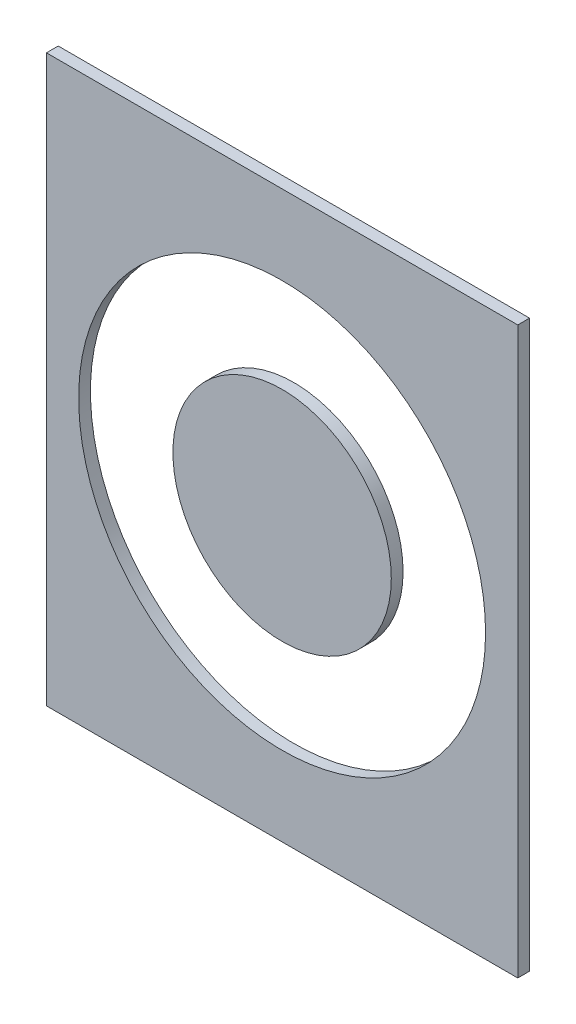
ISO-10303-21;
HEADER;
FILE_DESCRIPTION(('STEP AP214'),'2;1');
FILE_NAME('part.step','',(''),(''),'','','');
FILE_SCHEMA(('AUTOMOTIVE_DESIGN { 1 0 10303 214 1 1 1 1 }'));
ENDSEC;
DATA;
#1=APPLICATION_CONTEXT('core data for automotive mechanical design processes');
#2=APPLICATION_PROTOCOL_DEFINITION('international standard','automotive_design',2000,#1);
#3=PRODUCT_CONTEXT('',#1,'mechanical');
#4=PRODUCT('Part','Part','',(#3));
#5=PRODUCT_RELATED_PRODUCT_CATEGORY('part','',(#4));
#6=PRODUCT_DEFINITION_FORMATION('','',#4);
#7=PRODUCT_DEFINITION_CONTEXT('part definition',#1,'design');
#8=PRODUCT_DEFINITION('design','',#6,#7);
#9=PRODUCT_DEFINITION_SHAPE('','',#8);
#10=(LENGTH_UNIT() NAMED_UNIT(*) SI_UNIT(.MILLI.,.METRE.));
#11=(NAMED_UNIT(*) PLANE_ANGLE_UNIT() SI_UNIT($,.RADIAN.));
#12=(NAMED_UNIT(*) SI_UNIT($,.STERADIAN.) SOLID_ANGLE_UNIT());
#13=UNCERTAINTY_MEASURE_WITH_UNIT(LENGTH_MEASURE(1.E-05),#10,'distance_accuracy_value','');
#14=(GEOMETRIC_REPRESENTATION_CONTEXT(3) GLOBAL_UNCERTAINTY_ASSIGNED_CONTEXT((#13)) GLOBAL_UNIT_ASSIGNED_CONTEXT((#10,
#11,#12)) REPRESENTATION_CONTEXT('',''));
#15=CARTESIAN_POINT('',(0.,0.,0.));
#16=DIRECTION('',(0.,0.,1.));
#17=DIRECTION('',(1.,0.,0.));
#18=AXIS2_PLACEMENT_3D('',#15,#16,#17);
#19=CARTESIAN_POINT('',(-300.,-360.,15.));
#20=DIRECTION('',(1.,0.,0.));
#21=DIRECTION('',(0.,0.,-1.));
#22=AXIS2_PLACEMENT_3D('',#19,#20,#21);
#23=PLANE('',#22);
#24=DIRECTION('',(0.,-1.,0.));
#25=VECTOR('',#24,1.);
#26=CARTESIAN_POINT('',(-300.,-360.,0.));
#27=LINE('',#26,#25);
#28=CARTESIAN_POINT('',(-300.,360.,0.));
#29=VERTEX_POINT('',#28);
#30=CARTESIAN_POINT('',(-300.,-360.,0.));
#31=VERTEX_POINT('',#30);
#32=EDGE_CURVE('E110',#29,#31,#27,.T.);
#33=ORIENTED_EDGE('',*,*,#32,.T.);
#34=DIRECTION('',(0.,0.,-1.));
#35=VECTOR('',#34,1.);
#36=CARTESIAN_POINT('',(-300.,-360.,15.));
#37=LINE('',#36,#35);
#38=CARTESIAN_POINT('',(-300.,-360.,15.));
#39=VERTEX_POINT('',#38);
#40=EDGE_CURVE('E97',#39,#31,#37,.T.);
#41=ORIENTED_EDGE('',*,*,#40,.F.);
#42=DIRECTION('',(0.,-1.,0.));
#43=VECTOR('',#42,1.);
#44=CARTESIAN_POINT('',(-300.,-360.,15.));
#45=LINE('',#44,#43);
#46=CARTESIAN_POINT('',(-300.,360.,15.));
#47=VERTEX_POINT('',#46);
#48=EDGE_CURVE('E116',#47,#39,#45,.T.);
#49=ORIENTED_EDGE('',*,*,#48,.F.);
#50=DIRECTION('',(0.,0.,-1.));
#51=VECTOR('',#50,1.);
#52=CARTESIAN_POINT('',(-300.,360.,15.));
#53=LINE('',#52,#51);
#54=EDGE_CURVE('E99',#47,#29,#53,.T.);
#55=ORIENTED_EDGE('',*,*,#54,.T.);
#56=EDGE_LOOP('',(#33,#41,#49,#55));
#57=FACE_BOUND('',#56,.T.);
#58=ADVANCED_FACE('F43',(#57),#23,.F.);
#59=CARTESIAN_POINT('',(300.,-360.,15.));
#60=DIRECTION('',(0.,1.,0.));
#61=DIRECTION('',(0.,0.,1.));
#62=AXIS2_PLACEMENT_3D('',#59,#60,#61);
#63=PLANE('',#62);
#64=DIRECTION('',(1.,0.,0.));
#65=VECTOR('',#64,1.);
#66=CARTESIAN_POINT('',(300.,-360.,0.));
#67=LINE('',#66,#65);
#68=CARTESIAN_POINT('',(300.,-360.,0.));
#69=VERTEX_POINT('',#68);
#70=EDGE_CURVE('E60',#31,#69,#67,.T.);
#71=ORIENTED_EDGE('',*,*,#70,.T.);
#72=DIRECTION('',(0.,0.,-1.));
#73=VECTOR('',#72,1.);
#74=CARTESIAN_POINT('',(300.,-360.,15.));
#75=LINE('',#74,#73);
#76=CARTESIAN_POINT('',(300.,-360.,15.));
#77=VERTEX_POINT('',#76);
#78=EDGE_CURVE('E94',#77,#69,#75,.T.);
#79=ORIENTED_EDGE('',*,*,#78,.F.);
#80=DIRECTION('',(1.,0.,0.));
#81=VECTOR('',#80,1.);
#82=CARTESIAN_POINT('',(300.,-360.,15.));
#83=LINE('',#82,#81);
#84=EDGE_CURVE('E76',#39,#77,#83,.T.);
#85=ORIENTED_EDGE('',*,*,#84,.F.);
#86=ORIENTED_EDGE('',*,*,#40,.T.);
#87=EDGE_LOOP('',(#71,#79,#85,#86));
#88=FACE_BOUND('',#87,.T.);
#89=ADVANCED_FACE('F93',(#88),#63,.F.);
#90=CARTESIAN_POINT('',(300.,-360.,15.));
#91=DIRECTION('',(-1.,0.,0.));
#92=DIRECTION('',(0.,0.,1.));
#93=AXIS2_PLACEMENT_3D('',#90,#91,#92);
#94=PLANE('',#93);
#95=DIRECTION('',(0.,1.,0.));
#96=VECTOR('',#95,1.);
#97=CARTESIAN_POINT('',(300.,-360.,0.));
#98=LINE('',#97,#96);
#99=CARTESIAN_POINT('',(300.,360.,0.));
#100=VERTEX_POINT('',#99);
#101=EDGE_CURVE('E91',#69,#100,#98,.T.);
#102=ORIENTED_EDGE('',*,*,#101,.T.);
#103=DIRECTION('',(0.,0.,-1.));
#104=VECTOR('',#103,1.);
#105=CARTESIAN_POINT('',(300.,360.,15.));
#106=LINE('',#105,#104);
#107=CARTESIAN_POINT('',(300.,360.,15.));
#108=VERTEX_POINT('',#107);
#109=EDGE_CURVE('E117',#108,#100,#106,.T.);
#110=ORIENTED_EDGE('',*,*,#109,.F.);
#111=DIRECTION('',(0.,1.,0.));
#112=VECTOR('',#111,1.);
#113=CARTESIAN_POINT('',(300.,-360.,15.));
#114=LINE('',#113,#112);
#115=EDGE_CURVE('E102',#77,#108,#114,.T.);
#116=ORIENTED_EDGE('',*,*,#115,.F.);
#117=ORIENTED_EDGE('',*,*,#78,.T.);
#118=EDGE_LOOP('',(#102,#110,#116,#117));
#119=FACE_BOUND('',#118,.T.);
#120=ADVANCED_FACE('F101',(#119),#94,.F.);
#121=CARTESIAN_POINT('',(300.,360.,15.));
#122=DIRECTION('',(0.,-1.,0.));
#123=DIRECTION('',(0.,0.,-1.));
#124=AXIS2_PLACEMENT_3D('',#121,#122,#123);
#125=PLANE('',#124);
#126=DIRECTION('',(-1.,0.,0.));
#127=VECTOR('',#126,1.);
#128=CARTESIAN_POINT('',(300.,360.,0.));
#129=LINE('',#128,#127);
#130=EDGE_CURVE('E85',#100,#29,#129,.T.);
#131=ORIENTED_EDGE('',*,*,#130,.T.);
#132=ORIENTED_EDGE('',*,*,#54,.F.);
#133=DIRECTION('',(-1.,0.,0.));
#134=VECTOR('',#133,1.);
#135=CARTESIAN_POINT('',(300.,360.,15.));
#136=LINE('',#135,#134);
#137=EDGE_CURVE('E112',#108,#47,#136,.T.);
#138=ORIENTED_EDGE('',*,*,#137,.F.);
#139=ORIENTED_EDGE('',*,*,#109,.T.);
#140=EDGE_LOOP('',(#131,#132,#138,#139));
#141=FACE_BOUND('',#140,.T.);
#142=ADVANCED_FACE('F122',(#141),#125,.F.);
#143=CARTESIAN_POINT('',(0.,0.,15.));
#144=DIRECTION('',(0.,0.,1.));
#145=DIRECTION('',(1.,0.,0.));
#146=AXIS2_PLACEMENT_3D('',#143,#144,#145);
#147=PLANE('',#146);
#148=CARTESIAN_POINT('',(0.,0.,15.));
#149=DIRECTION('',(0.,0.,1.));
#150=DIRECTION('',(1.,0.,0.));
#151=AXIS2_PLACEMENT_3D('',#148,#149,#150);
#152=CIRCLE('',#151,259.);
#153=CARTESIAN_POINT('',(259.,0.,15.));
#154=VERTEX_POINT('',#153);
#155=EDGE_CURVE('E12',#154,#154,#152,.T.);
#156=ORIENTED_EDGE('',*,*,#155,.F.);
#157=EDGE_LOOP('',(#156));
#158=FACE_BOUND('',#157,.T.);
#159=ORIENTED_EDGE('',*,*,#48,.T.);
#160=ORIENTED_EDGE('',*,*,#84,.T.);
#161=ORIENTED_EDGE('',*,*,#115,.T.);
#162=ORIENTED_EDGE('',*,*,#137,.T.);
#163=EDGE_LOOP('',(#159,#160,#161,#162));
#164=FACE_BOUND('',#163,.T.);
#165=ADVANCED_FACE('F45',(#158,#164),#147,.T.);
#166=CARTESIAN_POINT('',(0.,0.,0.));
#167=DIRECTION('',(0.,0.,1.));
#168=DIRECTION('',(1.,0.,0.));
#169=AXIS2_PLACEMENT_3D('',#166,#167,#168);
#170=PLANE('',#169);
#171=CARTESIAN_POINT('',(0.,0.,0.));
#172=DIRECTION('',(0.,0.,1.));
#173=DIRECTION('',(1.,0.,0.));
#174=AXIS2_PLACEMENT_3D('',#171,#172,#173);
#175=CIRCLE('',#174,259.);
#176=CARTESIAN_POINT('',(259.,0.,0.));
#177=VERTEX_POINT('',#176);
#178=EDGE_CURVE('E47',#177,#177,#175,.T.);
#179=ORIENTED_EDGE('',*,*,#178,.T.);
#180=EDGE_LOOP('',(#179));
#181=FACE_BOUND('',#180,.T.);
#182=ORIENTED_EDGE('',*,*,#32,.F.);
#183=ORIENTED_EDGE('',*,*,#130,.F.);
#184=ORIENTED_EDGE('',*,*,#101,.F.);
#185=ORIENTED_EDGE('',*,*,#70,.F.);
#186=EDGE_LOOP('',(#182,#183,#184,#185));
#187=FACE_BOUND('',#186,.T.);
#188=ADVANCED_FACE('F104',(#181,#187),#170,.F.);
#189=CARTESIAN_POINT('',(0.,0.,0.));
#190=DIRECTION('',(0.,0.,1.));
#191=DIRECTION('',(1.,0.,0.));
#192=AXIS2_PLACEMENT_3D('',#189,#190,#191);
#193=CYLINDRICAL_SURFACE('',#192,259.);
#194=ORIENTED_EDGE('',*,*,#178,.F.);
#195=EDGE_LOOP('',(#194));
#196=FACE_BOUND('',#195,.T.);
#197=ORIENTED_EDGE('',*,*,#155,.T.);
#198=EDGE_LOOP('',(#197));
#199=FACE_BOUND('',#198,.T.);
#200=ADVANCED_FACE('F129',(#196,#199),#193,.F.);
#201=CLOSED_SHELL('',(#58,#89,#120,#142,#165,#188,#200));
#202=MANIFOLD_SOLID_BREP('B2',#201);
#203=CARTESIAN_POINT('',(0.,0.,0.));
#204=DIRECTION('',(0.,0.,1.));
#205=DIRECTION('',(1.,0.,0.));
#206=AXIS2_PLACEMENT_3D('',#203,#204,#205);
#207=PLANE('',#206);
#208=CARTESIAN_POINT('',(0.,0.,0.));
#209=DIRECTION('',(0.,0.,1.));
#210=DIRECTION('',(1.,0.,0.));
#211=AXIS2_PLACEMENT_3D('',#208,#209,#210);
#212=CIRCLE('',#211,139.);
#213=CARTESIAN_POINT('',(139.,0.,0.));
#214=VERTEX_POINT('',#213);
#215=EDGE_CURVE('E42',#214,#214,#212,.T.);
#216=ORIENTED_EDGE('',*,*,#215,.F.);
#217=EDGE_LOOP('',(#216));
#218=FACE_BOUND('',#217,.T.);
#219=ADVANCED_FACE('F188',(#218),#207,.F.);
#220=CARTESIAN_POINT('',(0.,0.,0.));
#221=DIRECTION('',(0.,0.,1.));
#222=DIRECTION('',(1.,0.,0.));
#223=AXIS2_PLACEMENT_3D('',#220,#221,#222);
#224=CYLINDRICAL_SURFACE('',#223,139.);
#225=ORIENTED_EDGE('',*,*,#215,.T.);
#226=EDGE_LOOP('',(#225));
#227=FACE_BOUND('',#226,.T.);
#228=CARTESIAN_POINT('',(0.,0.,15.));
#229=DIRECTION('',(0.,0.,1.));
#230=DIRECTION('',(1.,0.,0.));
#231=AXIS2_PLACEMENT_3D('',#228,#229,#230);
#232=CIRCLE('',#231,139.);
#233=CARTESIAN_POINT('',(139.,0.,15.));
#234=VERTEX_POINT('',#233);
#235=EDGE_CURVE('E191',#234,#234,#232,.T.);
#236=ORIENTED_EDGE('',*,*,#235,.F.);
#237=EDGE_LOOP('',(#236));
#238=FACE_BOUND('',#237,.T.);
#239=ADVANCED_FACE('F202',(#227,#238),#224,.T.);
#240=CARTESIAN_POINT('',(0.,0.,15.));
#241=DIRECTION('',(0.,0.,1.));
#242=DIRECTION('',(1.,0.,0.));
#243=AXIS2_PLACEMENT_3D('',#240,#241,#242);
#244=PLANE('',#243);
#245=ORIENTED_EDGE('',*,*,#235,.T.);
#246=EDGE_LOOP('',(#245));
#247=FACE_BOUND('',#246,.T.);
#248=ADVANCED_FACE('F200',(#247),#244,.T.);
#249=CLOSED_SHELL('',(#219,#239,#248));
#250=MANIFOLD_SOLID_BREP('B6',#249);
#251=ADVANCED_BREP_SHAPE_REPRESENTATION('',(#18,#202,#250),#14);
#252=SHAPE_DEFINITION_REPRESENTATION(#9,#251);
ENDSEC;
END-ISO-10303-21;
